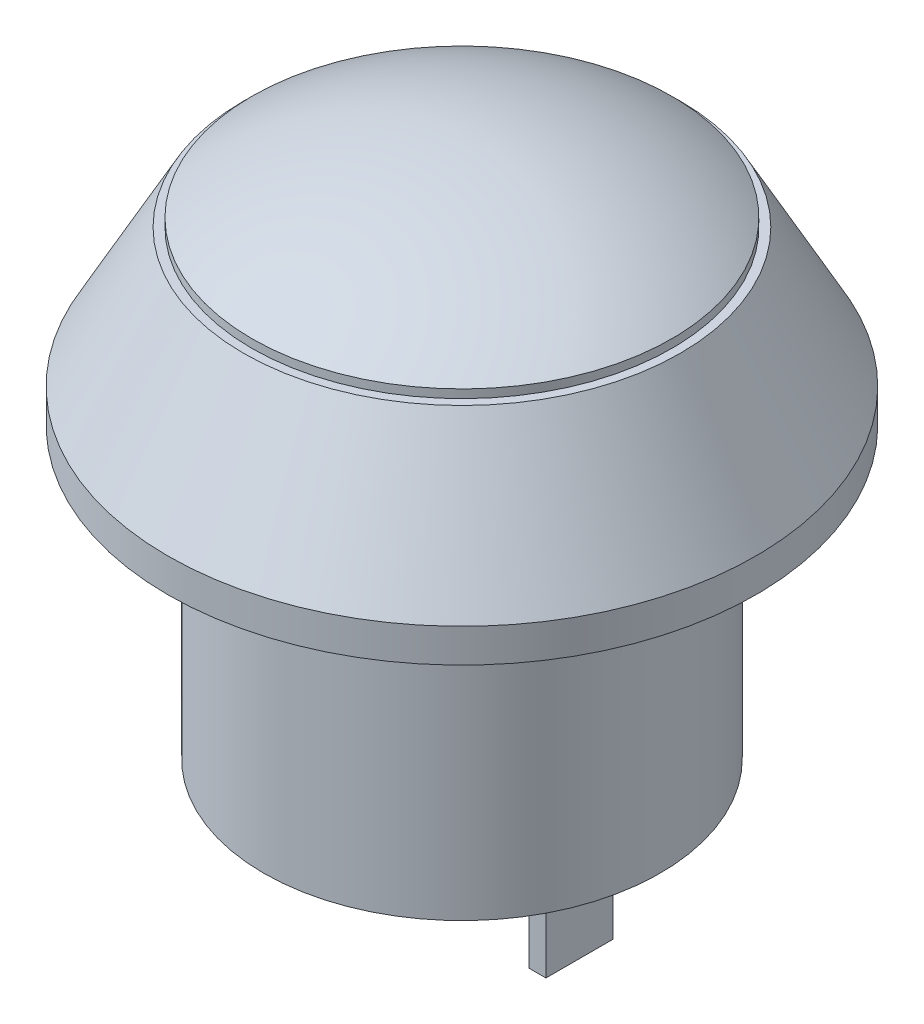
ISO-10303-21;
HEADER;
FILE_DESCRIPTION(('STEP AP214'),'2;1');
FILE_NAME('part.step','',(''),(''),'','','');
FILE_SCHEMA(('AUTOMOTIVE_DESIGN { 1 0 10303 214 1 1 1 1 }'));
ENDSEC;
DATA;
#1=APPLICATION_CONTEXT('core data for automotive mechanical design processes');
#2=APPLICATION_PROTOCOL_DEFINITION('international standard','automotive_design',2000,#1);
#3=PRODUCT_CONTEXT('',#1,'mechanical');
#4=PRODUCT('Part','Part','',(#3));
#5=PRODUCT_RELATED_PRODUCT_CATEGORY('part','',(#4));
#6=PRODUCT_DEFINITION_FORMATION('','',#4);
#7=PRODUCT_DEFINITION_CONTEXT('part definition',#1,'design');
#8=PRODUCT_DEFINITION('design','',#6,#7);
#9=PRODUCT_DEFINITION_SHAPE('','',#8);
#10=(LENGTH_UNIT() NAMED_UNIT(*) SI_UNIT(.MILLI.,.METRE.));
#11=(NAMED_UNIT(*) PLANE_ANGLE_UNIT() SI_UNIT($,.RADIAN.));
#12=(NAMED_UNIT(*) SI_UNIT($,.STERADIAN.) SOLID_ANGLE_UNIT());
#13=UNCERTAINTY_MEASURE_WITH_UNIT(LENGTH_MEASURE(1.E-05),#10,'distance_accuracy_value','');
#14=(GEOMETRIC_REPRESENTATION_CONTEXT(3) GLOBAL_UNCERTAINTY_ASSIGNED_CONTEXT((#13)) GLOBAL_UNIT_ASSIGNED_CONTEXT((#10,
#11,#12)) REPRESENTATION_CONTEXT('',''));
#15=CARTESIAN_POINT('',(0.,0.,0.));
#16=DIRECTION('',(0.,0.,1.));
#17=DIRECTION('',(1.,0.,0.));
#18=AXIS2_PLACEMENT_3D('',#15,#16,#17);
#19=CARTESIAN_POINT('',(0.,0.,0.));
#20=DIRECTION('',(0.,-1.,0.));
#21=DIRECTION('',(0.,0.,-1.));
#22=AXIS2_PLACEMENT_3D('',#19,#20,#21);
#23=PLANE('',#22);
#24=CARTESIAN_POINT('',(0.,0.,0.));
#25=DIRECTION('',(0.,-1.,0.));
#26=DIRECTION('',(0.,0.,-1.));
#27=AXIS2_PLACEMENT_3D('',#24,#25,#26);
#28=CIRCLE('',#27,5.9);
#29=CARTESIAN_POINT('',(0.,0.,5.9));
#30=VERTEX_POINT('',#29);
#31=EDGE_CURVE('E11',#30,#30,#28,.T.);
#32=ORIENTED_EDGE('',*,*,#31,.F.);
#33=EDGE_LOOP('',(#32));
#34=FACE_BOUND('',#33,.T.);
#35=CARTESIAN_POINT('',(0.,0.,0.));
#36=DIRECTION('',(0.,1.,0.));
#37=DIRECTION('',(0.,0.,1.));
#38=AXIS2_PLACEMENT_3D('',#35,#36,#37);
#39=CIRCLE('',#38,8.75);
#40=CARTESIAN_POINT('',(0.,0.,8.75));
#41=VERTEX_POINT('',#40);
#42=EDGE_CURVE('E46',#41,#41,#39,.T.);
#43=ORIENTED_EDGE('',*,*,#42,.F.);
#44=EDGE_LOOP('',(#43));
#45=FACE_BOUND('',#44,.T.);
#46=ADVANCED_FACE('F43',(#34,#45),#23,.T.);
#47=CARTESIAN_POINT('',(0.,7.3,0.));
#48=DIRECTION('',(0.,1.,0.));
#49=DIRECTION('',(0.,0.,1.));
#50=AXIS2_PLACEMENT_3D('',#47,#48,#49);
#51=CYLINDRICAL_SURFACE('',#50,8.75);
#52=ORIENTED_EDGE('',*,*,#42,.T.);
#53=EDGE_LOOP('',(#52));
#54=FACE_BOUND('',#53,.T.);
#55=CARTESIAN_POINT('',(0.,0.999999999999999,0.));
#56=DIRECTION('',(0.,1.,0.));
#57=DIRECTION('',(0.,0.,1.));
#58=AXIS2_PLACEMENT_3D('',#55,#56,#57);
#59=CIRCLE('',#58,8.75);
#60=CARTESIAN_POINT('',(0.,0.999999999999999,8.75));
#61=VERTEX_POINT('',#60);
#62=EDGE_CURVE('E187',#61,#61,#59,.T.);
#63=ORIENTED_EDGE('',*,*,#62,.F.);
#64=EDGE_LOOP('',(#63));
#65=FACE_BOUND('',#64,.T.);
#66=ADVANCED_FACE('F194',(#54,#65),#51,.T.);
#67=CARTESIAN_POINT('',(0.,5.1,0.));
#68=DIRECTION('',(0.,-1.,0.));
#69=DIRECTION('',(0.,0.,-1.));
#70=AXIS2_PLACEMENT_3D('',#67,#68,#69);
#71=CONICAL_SURFACE('',#70,6.5,0.501906443051993);
#72=ORIENTED_EDGE('',*,*,#62,.T.);
#73=EDGE_LOOP('',(#72));
#74=FACE_BOUND('',#73,.T.);
#75=CARTESIAN_POINT('',(0.,5.1,0.));
#76=DIRECTION('',(0.,1.,0.));
#77=DIRECTION('',(0.,0.,1.));
#78=AXIS2_PLACEMENT_3D('',#75,#76,#77);
#79=CIRCLE('',#78,6.5);
#80=CARTESIAN_POINT('',(0.,5.1,6.5));
#81=VERTEX_POINT('',#80);
#82=EDGE_CURVE('E185',#81,#81,#79,.T.);
#83=ORIENTED_EDGE('',*,*,#82,.F.);
#84=EDGE_LOOP('',(#83));
#85=FACE_BOUND('',#84,.T.);
#86=ADVANCED_FACE('F204',(#74,#85),#71,.T.);
#87=CARTESIAN_POINT('',(-6.5,5.1,0.));
#88=DIRECTION('',(0.,1.,0.));
#89=DIRECTION('',(0.,0.,1.));
#90=AXIS2_PLACEMENT_3D('',#87,#88,#89);
#91=PLANE('',#90);
#92=ORIENTED_EDGE('',*,*,#82,.T.);
#93=EDGE_LOOP('',(#92));
#94=FACE_BOUND('',#93,.T.);
#95=CARTESIAN_POINT('',(0.,5.1,0.));
#96=DIRECTION('',(0.,1.,0.));
#97=DIRECTION('',(0.,0.,1.));
#98=AXIS2_PLACEMENT_3D('',#95,#96,#97);
#99=CIRCLE('',#98,6.25);
#100=CARTESIAN_POINT('',(0.,5.1,6.25));
#101=VERTEX_POINT('',#100);
#102=EDGE_CURVE('E182',#101,#101,#99,.T.);
#103=ORIENTED_EDGE('',*,*,#102,.F.);
#104=EDGE_LOOP('',(#103));
#105=FACE_BOUND('',#104,.T.);
#106=ADVANCED_FACE('F225',(#94,#105),#91,.T.);
#107=CARTESIAN_POINT('',(0.,7.3,0.));
#108=DIRECTION('',(0.,1.,0.));
#109=DIRECTION('',(0.,0.,1.));
#110=AXIS2_PLACEMENT_3D('',#107,#108,#109);
#111=CYLINDRICAL_SURFACE('',#110,6.25);
#112=ORIENTED_EDGE('',*,*,#102,.T.);
#113=EDGE_LOOP('',(#112));
#114=FACE_BOUND('',#113,.T.);
#115=CARTESIAN_POINT('',(0.,5.35,0.));
#116=DIRECTION('',(0.,1.,0.));
#117=DIRECTION('',(0.,0.,1.));
#118=AXIS2_PLACEMENT_3D('',#115,#116,#117);
#119=CIRCLE('',#118,6.25);
#120=CARTESIAN_POINT('',(0.,5.35,6.25));
#121=VERTEX_POINT('',#120);
#122=EDGE_CURVE('E178',#121,#121,#119,.T.);
#123=ORIENTED_EDGE('',*,*,#122,.F.);
#124=EDGE_LOOP('',(#123));
#125=FACE_BOUND('',#124,.T.);
#126=ADVANCED_FACE('F217',(#114,#125),#111,.T.);
#127=CARTESIAN_POINT('',(0.,-3.69102564102564,0.));
#128=DIRECTION('',(0.,1.,0.));
#129=DIRECTION('',(-1.,0.,0.));
#130=AXIS2_PLACEMENT_3D('',#127,#128,#129);
#131=SPHERICAL_SURFACE('',#130,10.9910256410256);
#132=ORIENTED_EDGE('',*,*,#122,.T.);
#133=EDGE_LOOP('',(#132));
#134=FACE_BOUND('',#133,.T.);
#135=ADVANCED_FACE('F209',(#134),#131,.T.);
#136=CARTESIAN_POINT('',(0.,-8.6,0.));
#137=DIRECTION('',(0.,1.,0.));
#138=DIRECTION('',(0.,0.,1.));
#139=AXIS2_PLACEMENT_3D('',#136,#137,#138);
#140=CYLINDRICAL_SURFACE('',#139,5.9);
#141=CARTESIAN_POINT('',(0.,-8.6,0.));
#142=DIRECTION('',(0.,-1.,0.));
#143=DIRECTION('',(0.,0.,-1.));
#144=AXIS2_PLACEMENT_3D('',#141,#142,#143);
#145=CIRCLE('',#144,5.9);
#146=CARTESIAN_POINT('',(0.,-8.6,5.9));
#147=VERTEX_POINT('',#146);
#148=EDGE_CURVE('E141',#147,#147,#145,.T.);
#149=CARTESIAN_POINT('',(0.,-8.6,5.9));
#150=CARTESIAN_POINT('',(0.,-8.51041666666666,5.9));
#151=CARTESIAN_POINT('',(0.,-8.42083333333333,5.9));
#152=CARTESIAN_POINT('',(0.,-8.24166666666667,5.9));
#153=CARTESIAN_POINT('',(0.,-8.15208333333333,5.9));
#154=CARTESIAN_POINT('',(0.,-7.97291666666667,5.9));
#155=CARTESIAN_POINT('',(0.,-7.88333333333333,5.9));
#156=CARTESIAN_POINT('',(0.,-7.70416666666667,5.9));
#157=CARTESIAN_POINT('',(0.,-7.61458333333333,5.9));
#158=CARTESIAN_POINT('',(0.,-7.43541666666667,5.9));
#159=CARTESIAN_POINT('',(0.,-7.34583333333333,5.9));
#160=CARTESIAN_POINT('',(0.,-7.16666666666667,5.9));
#161=CARTESIAN_POINT('',(0.,-7.07708333333333,5.9));
#162=CARTESIAN_POINT('',(0.,-6.89791666666667,5.9));
#163=CARTESIAN_POINT('',(0.,-6.80833333333333,5.9));
#164=CARTESIAN_POINT('',(0.,-6.62916666666667,5.9));
#165=CARTESIAN_POINT('',(0.,-6.53958333333333,5.9));
#166=CARTESIAN_POINT('',(0.,-6.36041666666667,5.9));
#167=CARTESIAN_POINT('',(0.,-6.27083333333333,5.9));
#168=CARTESIAN_POINT('',(0.,-6.09166666666667,5.9));
#169=CARTESIAN_POINT('',(0.,-6.00208333333333,5.9));
#170=CARTESIAN_POINT('',(0.,-5.82291666666667,5.9));
#171=CARTESIAN_POINT('',(0.,-5.73333333333333,5.9));
#172=CARTESIAN_POINT('',(0.,-5.55416666666667,5.9));
#173=CARTESIAN_POINT('',(0.,-5.46458333333333,5.9));
#174=CARTESIAN_POINT('',(0.,-5.28541666666667,5.9));
#175=CARTESIAN_POINT('',(0.,-5.19583333333333,5.9));
#176=CARTESIAN_POINT('',(0.,-5.01666666666667,5.9));
#177=CARTESIAN_POINT('',(0.,-4.92708333333333,5.9));
#178=CARTESIAN_POINT('',(0.,-4.74791666666667,5.9));
#179=CARTESIAN_POINT('',(0.,-4.65833333333333,5.9));
#180=CARTESIAN_POINT('',(0.,-4.47916666666667,5.9));
#181=CARTESIAN_POINT('',(0.,-4.38958333333333,5.9));
#182=CARTESIAN_POINT('',(0.,-4.21041666666667,5.9));
#183=CARTESIAN_POINT('',(0.,-4.12083333333333,5.9));
#184=CARTESIAN_POINT('',(0.,-3.94166666666667,5.9));
#185=CARTESIAN_POINT('',(0.,-3.85208333333333,5.9));
#186=CARTESIAN_POINT('',(0.,-3.67291666666667,5.9));
#187=CARTESIAN_POINT('',(0.,-3.58333333333333,5.9));
#188=CARTESIAN_POINT('',(0.,-3.40416666666667,5.9));
#189=CARTESIAN_POINT('',(0.,-3.31458333333333,5.9));
#190=CARTESIAN_POINT('',(0.,-3.13541666666667,5.9));
#191=CARTESIAN_POINT('',(0.,-3.04583333333333,5.9));
#192=CARTESIAN_POINT('',(0.,-2.86666666666667,5.9));
#193=CARTESIAN_POINT('',(0.,-2.77708333333333,5.9));
#194=CARTESIAN_POINT('',(0.,-2.59791666666667,5.9));
#195=CARTESIAN_POINT('',(0.,-2.50833333333333,5.9));
#196=CARTESIAN_POINT('',(0.,-2.32916666666667,5.9));
#197=CARTESIAN_POINT('',(0.,-2.23958333333333,5.9));
#198=CARTESIAN_POINT('',(0.,-2.06041666666667,5.9));
#199=CARTESIAN_POINT('',(0.,-1.97083333333333,5.9));
#200=CARTESIAN_POINT('',(0.,-1.79166666666667,5.9));
#201=CARTESIAN_POINT('',(0.,-1.70208333333333,5.9));
#202=CARTESIAN_POINT('',(0.,-1.52291666666667,5.9));
#203=CARTESIAN_POINT('',(0.,-1.43333333333333,5.9));
#204=CARTESIAN_POINT('',(0.,-1.25416666666667,5.9));
#205=CARTESIAN_POINT('',(0.,-1.16458333333333,5.9));
#206=CARTESIAN_POINT('',(0.,-0.985416666666665,5.9));
#207=CARTESIAN_POINT('',(0.,-0.895833333333332,5.9));
#208=CARTESIAN_POINT('',(0.,-0.716666666666665,5.9));
#209=CARTESIAN_POINT('',(0.,-0.627083333333332,5.9));
#210=CARTESIAN_POINT('',(0.,-0.447916666666665,5.9));
#211=CARTESIAN_POINT('',(0.,-0.358333333333331,5.9));
#212=CARTESIAN_POINT('',(0.,-0.179166666666665,5.9));
#213=CARTESIAN_POINT('',(0.,-0.0895833333333315,5.9));
#214=CARTESIAN_POINT('',(0.,0.,5.9));
#215=B_SPLINE_CURVE_WITH_KNOTS('',3,(#149,#150,#151,#152,#153,#154,#155,#156,#157,#158,#159,
#160,#161,#162,#163,#164,#165,#166,#167,#168,#169,#170,#171,#172,#173,#174,#175,#176,#177,#178,
#179,#180,#181,#182,#183,#184,#185,#186,#187,#188,#189,#190,#191,#192,#193,#194,#195,#196,#197,
#198,#199,#200,#201,#202,#203,#204,#205,#206,#207,#208,#209,#210,#211,#212,#213,#214),
.UNSPECIFIED.,.F.,.F.,(4,2,2,2,2,2,2,2,2,2,2,2,2,2,2,2,2,2,2,2,2,2,2,2,2,2,2,2,2,2,2,2,4),(0.,
0.26875,0.5375,0.806249999999999,1.075,1.34375,1.6125,1.88125,2.15,2.41875,2.6875,2.95625,3.225,
3.49375,3.7625,4.03125,4.3,4.56875,4.8375,5.10625,5.375,5.64375,5.9125,6.18125,6.45,6.71875,
6.9875,7.25625,7.525,7.79375,8.0625,8.33125,8.6),.UNSPECIFIED.);
#216=EDGE_CURVE('BSEAM207',#147,#30,#215,.T.);
#217=ORIENTED_EDGE('',*,*,#148,.F.);
#218=ORIENTED_EDGE('',*,*,#31,.T.);
#219=ORIENTED_EDGE('',*,*,#216,.T.);
#220=ORIENTED_EDGE('',*,*,#216,.F.);
#221=EDGE_LOOP('',(#217,#219,#218,#220));
#222=FACE_BOUND('',#221,.T.);
#223=ADVANCED_FACE('F207',(#222),#140,.T.);
#224=CARTESIAN_POINT('',(0.,-8.6,0.));
#225=DIRECTION('',(0.,-1.,0.));
#226=DIRECTION('',(0.,0.,-1.));
#227=AXIS2_PLACEMENT_3D('',#224,#225,#226);
#228=PLANE('',#227);
#229=DIRECTION('',(1.,0.,0.));
#230=VECTOR('',#229,1.);
#231=CARTESIAN_POINT('',(-3.5,-8.6,1.));
#232=LINE('',#231,#230);
#233=CARTESIAN_POINT('',(-3.5,-8.6,1.));
#234=VERTEX_POINT('',#233);
#235=CARTESIAN_POINT('',(-3.,-8.6,1.));
#236=VERTEX_POINT('',#235);
#237=EDGE_CURVE('E135',#234,#236,#232,.T.);
#238=ORIENTED_EDGE('',*,*,#237,.T.);
#239=DIRECTION('',(0.,0.,-1.));
#240=VECTOR('',#239,1.);
#241=CARTESIAN_POINT('',(-3.,-8.6,1.));
#242=LINE('',#241,#240);
#243=CARTESIAN_POINT('',(-3.,-8.6,-1.));
#244=VERTEX_POINT('',#243);
#245=EDGE_CURVE('E112',#236,#244,#242,.T.);
#246=ORIENTED_EDGE('',*,*,#245,.T.);
#247=DIRECTION('',(1.,0.,0.));
#248=VECTOR('',#247,1.);
#249=CARTESIAN_POINT('',(-3.5,-8.6,-1.));
#250=LINE('',#249,#248);
#251=CARTESIAN_POINT('',(-3.5,-8.6,-1.));
#252=VERTEX_POINT('',#251);
#253=EDGE_CURVE('E63',#252,#244,#250,.T.);
#254=ORIENTED_EDGE('',*,*,#253,.F.);
#255=DIRECTION('',(0.,0.,-1.));
#256=VECTOR('',#255,1.);
#257=CARTESIAN_POINT('',(-3.5,-8.6,1.));
#258=LINE('',#257,#256);
#259=EDGE_CURVE('E58',#234,#252,#258,.T.);
#260=ORIENTED_EDGE('',*,*,#259,.F.);
#261=EDGE_LOOP('',(#238,#246,#254,#260));
#262=FACE_BOUND('',#261,.T.);
#263=DIRECTION('',(1.,0.,0.));
#264=VECTOR('',#263,1.);
#265=CARTESIAN_POINT('',(3.,-8.6,1.));
#266=LINE('',#265,#264);
#267=CARTESIAN_POINT('',(3.,-8.6,1.));
#268=VERTEX_POINT('',#267);
#269=CARTESIAN_POINT('',(3.5,-8.6,1.));
#270=VERTEX_POINT('',#269);
#271=EDGE_CURVE('E137',#268,#270,#266,.T.);
#272=ORIENTED_EDGE('',*,*,#271,.T.);
#273=DIRECTION('',(0.,0.,-1.));
#274=VECTOR('',#273,1.);
#275=CARTESIAN_POINT('',(3.5,-8.6,1.));
#276=LINE('',#275,#274);
#277=CARTESIAN_POINT('',(3.5,-8.6,-1.));
#278=VERTEX_POINT('',#277);
#279=EDGE_CURVE('E166',#270,#278,#276,.T.);
#280=ORIENTED_EDGE('',*,*,#279,.T.);
#281=DIRECTION('',(1.,0.,0.));
#282=VECTOR('',#281,1.);
#283=CARTESIAN_POINT('',(3.,-8.6,-1.));
#284=LINE('',#283,#282);
#285=CARTESIAN_POINT('',(3.,-8.6,-1.));
#286=VERTEX_POINT('',#285);
#287=EDGE_CURVE('E162',#286,#278,#284,.T.);
#288=ORIENTED_EDGE('',*,*,#287,.F.);
#289=DIRECTION('',(0.,0.,-1.));
#290=VECTOR('',#289,1.);
#291=CARTESIAN_POINT('',(3.,-8.6,1.));
#292=LINE('',#291,#290);
#293=EDGE_CURVE('E159',#268,#286,#292,.T.);
#294=ORIENTED_EDGE('',*,*,#293,.F.);
#295=EDGE_LOOP('',(#272,#280,#288,#294));
#296=FACE_BOUND('',#295,.T.);
#297=ORIENTED_EDGE('',*,*,#148,.T.);
#298=EDGE_LOOP('',(#297));
#299=FACE_BOUND('',#298,.T.);
#300=ADVANCED_FACE('F208',(#262,#296,#299),#228,.T.);
#301=CARTESIAN_POINT('',(3.,-12.,1.));
#302=DIRECTION('',(0.,0.,1.));
#303=DIRECTION('',(1.,0.,0.));
#304=AXIS2_PLACEMENT_3D('',#301,#302,#303);
#305=PLANE('',#304);
#306=ORIENTED_EDGE('',*,*,#271,.F.);
#307=DIRECTION('',(0.,1.,0.));
#308=VECTOR('',#307,1.);
#309=CARTESIAN_POINT('',(3.,-12.,1.));
#310=LINE('',#309,#308);
#311=CARTESIAN_POINT('',(3.,-12.,1.));
#312=VERTEX_POINT('',#311);
#313=EDGE_CURVE('E156',#312,#268,#310,.T.);
#314=ORIENTED_EDGE('',*,*,#313,.F.);
#315=DIRECTION('',(1.,0.,0.));
#316=VECTOR('',#315,1.);
#317=CARTESIAN_POINT('',(3.,-12.,1.));
#318=LINE('',#317,#316);
#319=CARTESIAN_POINT('',(3.5,-12.,1.));
#320=VERTEX_POINT('',#319);
#321=EDGE_CURVE('E163',#312,#320,#318,.T.);
#322=ORIENTED_EDGE('',*,*,#321,.T.);
#323=DIRECTION('',(0.,1.,0.));
#324=VECTOR('',#323,1.);
#325=CARTESIAN_POINT('',(3.5,-12.,1.));
#326=LINE('',#325,#324);
#327=EDGE_CURVE('E146',#320,#270,#326,.T.);
#328=ORIENTED_EDGE('',*,*,#327,.T.);
#329=EDGE_LOOP('',(#306,#314,#322,#328));
#330=FACE_BOUND('',#329,.T.);
#331=ADVANCED_FACE('F215',(#330),#305,.T.);
#332=CARTESIAN_POINT('',(3.,-12.,1.));
#333=DIRECTION('',(1.,0.,0.));
#334=DIRECTION('',(0.,0.,-1.));
#335=AXIS2_PLACEMENT_3D('',#332,#333,#334);
#336=PLANE('',#335);
#337=ORIENTED_EDGE('',*,*,#293,.T.);
#338=DIRECTION('',(0.,1.,0.));
#339=VECTOR('',#338,1.);
#340=CARTESIAN_POINT('',(3.,-12.,-1.));
#341=LINE('',#340,#339);
#342=CARTESIAN_POINT('',(3.,-12.,-1.));
#343=VERTEX_POINT('',#342);
#344=EDGE_CURVE('E153',#343,#286,#341,.T.);
#345=ORIENTED_EDGE('',*,*,#344,.F.);
#346=DIRECTION('',(0.,0.,-1.));
#347=VECTOR('',#346,1.);
#348=CARTESIAN_POINT('',(3.,-12.,1.));
#349=LINE('',#348,#347);
#350=EDGE_CURVE('E149',#312,#343,#349,.T.);
#351=ORIENTED_EDGE('',*,*,#350,.F.);
#352=ORIENTED_EDGE('',*,*,#313,.T.);
#353=EDGE_LOOP('',(#337,#345,#351,#352));
#354=FACE_BOUND('',#353,.T.);
#355=ADVANCED_FACE('F277',(#354),#336,.F.);
#356=CARTESIAN_POINT('',(3.,-12.,-1.));
#357=DIRECTION('',(0.,0.,1.));
#358=DIRECTION('',(1.,0.,0.));
#359=AXIS2_PLACEMENT_3D('',#356,#357,#358);
#360=PLANE('',#359);
#361=ORIENTED_EDGE('',*,*,#287,.T.);
#362=DIRECTION('',(0.,1.,0.));
#363=VECTOR('',#362,1.);
#364=CARTESIAN_POINT('',(3.5,-12.,-1.));
#365=LINE('',#364,#363);
#366=CARTESIAN_POINT('',(3.5,-12.,-1.));
#367=VERTEX_POINT('',#366);
#368=EDGE_CURVE('E150',#367,#278,#365,.T.);
#369=ORIENTED_EDGE('',*,*,#368,.F.);
#370=DIRECTION('',(1.,0.,0.));
#371=VECTOR('',#370,1.);
#372=CARTESIAN_POINT('',(3.,-12.,-1.));
#373=LINE('',#372,#371);
#374=EDGE_CURVE('E170',#343,#367,#373,.T.);
#375=ORIENTED_EDGE('',*,*,#374,.F.);
#376=ORIENTED_EDGE('',*,*,#344,.T.);
#377=EDGE_LOOP('',(#361,#369,#375,#376));
#378=FACE_BOUND('',#377,.T.);
#379=ADVANCED_FACE('F289',(#378),#360,.F.);
#380=CARTESIAN_POINT('',(3.5,-12.,1.));
#381=DIRECTION('',(1.,0.,0.));
#382=DIRECTION('',(0.,0.,-1.));
#383=AXIS2_PLACEMENT_3D('',#380,#381,#382);
#384=PLANE('',#383);
#385=ORIENTED_EDGE('',*,*,#279,.F.);
#386=ORIENTED_EDGE('',*,*,#327,.F.);
#387=DIRECTION('',(0.,0.,-1.));
#388=VECTOR('',#387,1.);
#389=CARTESIAN_POINT('',(3.5,-12.,1.));
#390=LINE('',#389,#388);
#391=EDGE_CURVE('E172',#320,#367,#390,.T.);
#392=ORIENTED_EDGE('',*,*,#391,.T.);
#393=ORIENTED_EDGE('',*,*,#368,.T.);
#394=EDGE_LOOP('',(#385,#386,#392,#393));
#395=FACE_BOUND('',#394,.T.);
#396=ADVANCED_FACE('F301',(#395),#384,.T.);
#397=CARTESIAN_POINT('',(0.,-12.,0.));
#398=DIRECTION('',(0.,1.,0.));
#399=DIRECTION('',(0.,0.,1.));
#400=AXIS2_PLACEMENT_3D('',#397,#398,#399);
#401=PLANE('',#400);
#402=ORIENTED_EDGE('',*,*,#321,.F.);
#403=ORIENTED_EDGE('',*,*,#350,.T.);
#404=ORIENTED_EDGE('',*,*,#374,.T.);
#405=ORIENTED_EDGE('',*,*,#391,.F.);
#406=EDGE_LOOP('',(#402,#403,#404,#405));
#407=FACE_BOUND('',#406,.T.);
#408=ADVANCED_FACE('F313',(#407),#401,.F.);
#409=CARTESIAN_POINT('',(-3.5,-12.,1.));
#410=DIRECTION('',(0.,0.,1.));
#411=DIRECTION('',(1.,0.,0.));
#412=AXIS2_PLACEMENT_3D('',#409,#410,#411);
#413=PLANE('',#412);
#414=ORIENTED_EDGE('',*,*,#237,.F.);
#415=DIRECTION('',(0.,1.,0.));
#416=VECTOR('',#415,1.);
#417=CARTESIAN_POINT('',(-3.5,-12.,1.));
#418=LINE('',#417,#416);
#419=CARTESIAN_POINT('',(-3.5,-12.,1.));
#420=VERTEX_POINT('',#419);
#421=EDGE_CURVE('E128',#420,#234,#418,.T.);
#422=ORIENTED_EDGE('',*,*,#421,.F.);
#423=DIRECTION('',(1.,0.,0.));
#424=VECTOR('',#423,1.);
#425=CARTESIAN_POINT('',(-3.5,-12.,1.));
#426=LINE('',#425,#424);
#427=CARTESIAN_POINT('',(-3.,-12.,1.));
#428=VERTEX_POINT('',#427);
#429=EDGE_CURVE('E122',#420,#428,#426,.T.);
#430=ORIENTED_EDGE('',*,*,#429,.T.);
#431=DIRECTION('',(0.,1.,0.));
#432=VECTOR('',#431,1.);
#433=CARTESIAN_POINT('',(-3.,-12.,1.));
#434=LINE('',#433,#432);
#435=EDGE_CURVE('E107',#428,#236,#434,.T.);
#436=ORIENTED_EDGE('',*,*,#435,.T.);
#437=EDGE_LOOP('',(#414,#422,#430,#436));
#438=FACE_BOUND('',#437,.T.);
#439=ADVANCED_FACE('F127',(#438),#413,.T.);
#440=CARTESIAN_POINT('',(-3.5,-12.,1.));
#441=DIRECTION('',(1.,0.,0.));
#442=DIRECTION('',(0.,0.,-1.));
#443=AXIS2_PLACEMENT_3D('',#440,#441,#442);
#444=PLANE('',#443);
#445=ORIENTED_EDGE('',*,*,#259,.T.);
#446=DIRECTION('',(0.,1.,0.));
#447=VECTOR('',#446,1.);
#448=CARTESIAN_POINT('',(-3.5,-12.,-1.));
#449=LINE('',#448,#447);
#450=CARTESIAN_POINT('',(-3.5,-12.,-1.));
#451=VERTEX_POINT('',#450);
#452=EDGE_CURVE('E142',#451,#252,#449,.T.);
#453=ORIENTED_EDGE('',*,*,#452,.F.);
#454=DIRECTION('',(0.,0.,-1.));
#455=VECTOR('',#454,1.);
#456=CARTESIAN_POINT('',(-3.5,-12.,1.));
#457=LINE('',#456,#455);
#458=EDGE_CURVE('E117',#420,#451,#457,.T.);
#459=ORIENTED_EDGE('',*,*,#458,.F.);
#460=ORIENTED_EDGE('',*,*,#421,.T.);
#461=EDGE_LOOP('',(#445,#453,#459,#460));
#462=FACE_BOUND('',#461,.T.);
#463=ADVANCED_FACE('F335',(#462),#444,.F.);
#464=CARTESIAN_POINT('',(-3.5,-12.,-1.));
#465=DIRECTION('',(0.,0.,1.));
#466=DIRECTION('',(1.,0.,0.));
#467=AXIS2_PLACEMENT_3D('',#464,#465,#466);
#468=PLANE('',#467);
#469=ORIENTED_EDGE('',*,*,#253,.T.);
#470=DIRECTION('',(0.,1.,0.));
#471=VECTOR('',#470,1.);
#472=CARTESIAN_POINT('',(-3.,-12.,-1.));
#473=LINE('',#472,#471);
#474=CARTESIAN_POINT('',(-3.,-12.,-1.));
#475=VERTEX_POINT('',#474);
#476=EDGE_CURVE('E116',#475,#244,#473,.T.);
#477=ORIENTED_EDGE('',*,*,#476,.F.);
#478=DIRECTION('',(1.,0.,0.));
#479=VECTOR('',#478,1.);
#480=CARTESIAN_POINT('',(-3.5,-12.,-1.));
#481=LINE('',#480,#479);
#482=EDGE_CURVE('E124',#451,#475,#481,.T.);
#483=ORIENTED_EDGE('',*,*,#482,.F.);
#484=ORIENTED_EDGE('',*,*,#452,.T.);
#485=EDGE_LOOP('',(#469,#477,#483,#484));
#486=FACE_BOUND('',#485,.T.);
#487=ADVANCED_FACE('F346',(#486),#468,.F.);
#488=CARTESIAN_POINT('',(-3.,-12.,1.));
#489=DIRECTION('',(1.,0.,0.));
#490=DIRECTION('',(0.,0.,-1.));
#491=AXIS2_PLACEMENT_3D('',#488,#489,#490);
#492=PLANE('',#491);
#493=ORIENTED_EDGE('',*,*,#245,.F.);
#494=ORIENTED_EDGE('',*,*,#435,.F.);
#495=DIRECTION('',(0.,0.,-1.));
#496=VECTOR('',#495,1.);
#497=CARTESIAN_POINT('',(-3.,-12.,1.));
#498=LINE('',#497,#496);
#499=EDGE_CURVE('E111',#428,#475,#498,.T.);
#500=ORIENTED_EDGE('',*,*,#499,.T.);
#501=ORIENTED_EDGE('',*,*,#476,.T.);
#502=EDGE_LOOP('',(#493,#494,#500,#501));
#503=FACE_BOUND('',#502,.T.);
#504=ADVANCED_FACE('F109',(#503),#492,.T.);
#505=CARTESIAN_POINT('',(0.,-12.,0.));
#506=DIRECTION('',(0.,1.,0.));
#507=DIRECTION('',(0.,0.,1.));
#508=AXIS2_PLACEMENT_3D('',#505,#506,#507);
#509=PLANE('',#508);
#510=ORIENTED_EDGE('',*,*,#429,.F.);
#511=ORIENTED_EDGE('',*,*,#458,.T.);
#512=ORIENTED_EDGE('',*,*,#482,.T.);
#513=ORIENTED_EDGE('',*,*,#499,.F.);
#514=EDGE_LOOP('',(#510,#511,#512,#513));
#515=FACE_BOUND('',#514,.T.);
#516=ADVANCED_FACE('F121',(#515),#509,.F.);
#517=CLOSED_SHELL('',(#46,#66,#86,#106,#126,#135,#223,#300,#331,#355,#379,#396,#408,#439,#463,
#487,#504,#516));
#518=MANIFOLD_SOLID_BREP('B2',#517);
#519=ADVANCED_BREP_SHAPE_REPRESENTATION('',(#18,#518),#14);
#520=SHAPE_DEFINITION_REPRESENTATION(#9,#519);
ENDSEC;
END-ISO-10303-21;
